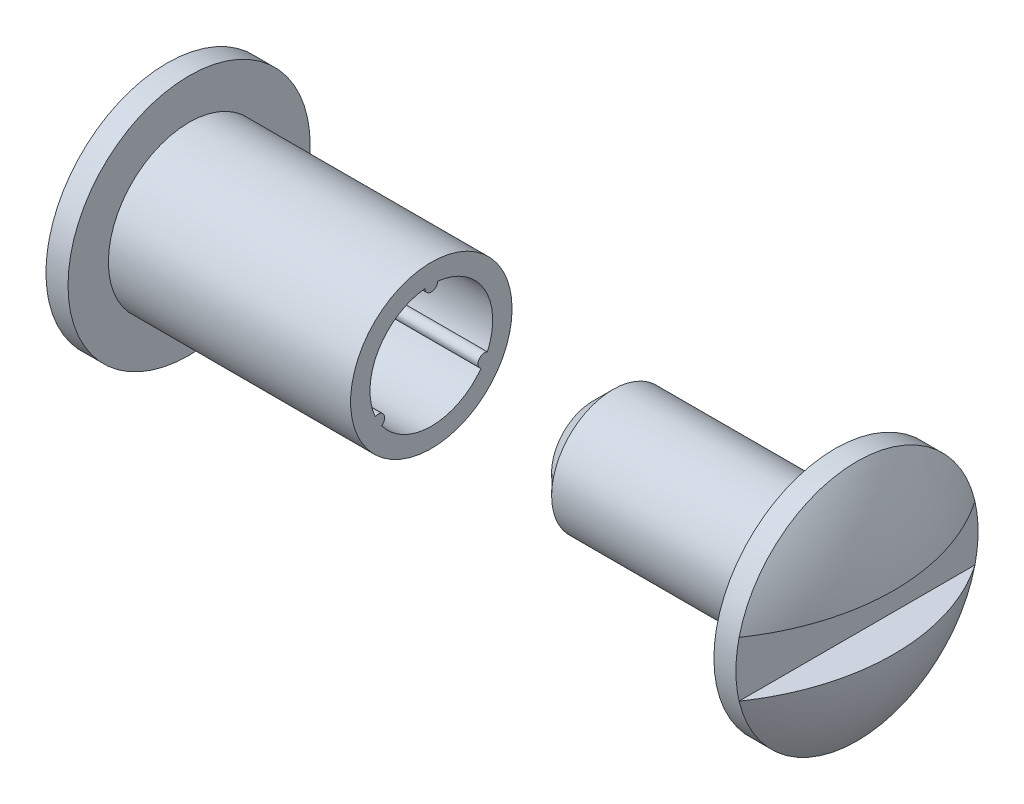
ISO-10303-21;
HEADER;
FILE_DESCRIPTION(('STEP AP214'),'2;1');
FILE_NAME('part.step','',(''),(''),'','','');
FILE_SCHEMA(('AUTOMOTIVE_DESIGN { 1 0 10303 214 1 1 1 1 }'));
ENDSEC;
DATA;
#1=APPLICATION_CONTEXT('core data for automotive mechanical design processes');
#2=APPLICATION_PROTOCOL_DEFINITION('international standard','automotive_design',2000,#1);
#3=PRODUCT_CONTEXT('',#1,'mechanical');
#4=PRODUCT('Part','Part','',(#3));
#5=PRODUCT_RELATED_PRODUCT_CATEGORY('part','',(#4));
#6=PRODUCT_DEFINITION_FORMATION('','',#4);
#7=PRODUCT_DEFINITION_CONTEXT('part definition',#1,'design');
#8=PRODUCT_DEFINITION('design','',#6,#7);
#9=PRODUCT_DEFINITION_SHAPE('','',#8);
#10=(LENGTH_UNIT() NAMED_UNIT(*) SI_UNIT(.MILLI.,.METRE.));
#11=(NAMED_UNIT(*) PLANE_ANGLE_UNIT() SI_UNIT($,.RADIAN.));
#12=(NAMED_UNIT(*) SI_UNIT($,.STERADIAN.) SOLID_ANGLE_UNIT());
#13=UNCERTAINTY_MEASURE_WITH_UNIT(LENGTH_MEASURE(1.E-05),#10,'distance_accuracy_value','');
#14=(GEOMETRIC_REPRESENTATION_CONTEXT(3) GLOBAL_UNCERTAINTY_ASSIGNED_CONTEXT((#13)) GLOBAL_UNIT_ASSIGNED_CONTEXT((#10,
#11,#12)) REPRESENTATION_CONTEXT('',''));
#15=CARTESIAN_POINT('',(0.,0.,0.));
#16=DIRECTION('',(0.,0.,1.));
#17=DIRECTION('',(1.,0.,0.));
#18=AXIS2_PLACEMENT_3D('',#15,#16,#17);
#19=CARTESIAN_POINT('',(9.525,0.,0.));
#20=DIRECTION('',(1.,0.,0.));
#21=DIRECTION('',(0.,0.,-1.));
#22=AXIS2_PLACEMENT_3D('',#19,#20,#21);
#23=PLANE('',#22);
#24=CARTESIAN_POINT('',(9.525,0.,0.));
#25=DIRECTION('',(-1.,0.,0.));
#26=DIRECTION('',(0.,0.,1.));
#27=AXIS2_PLACEMENT_3D('',#24,#25,#26);
#28=CIRCLE('',#27,4.7625);
#29=CARTESIAN_POINT('',(9.525,0.,4.7625));
#30=VERTEX_POINT('',#29);
#31=EDGE_CURVE('E96',#30,#30,#28,.T.);
#32=ORIENTED_EDGE('',*,*,#31,.T.);
#33=EDGE_LOOP('',(#32));
#34=FACE_BOUND('',#33,.T.);
#35=CARTESIAN_POINT('',(9.525,0.,0.));
#36=DIRECTION('',(1.,0.,0.));
#37=DIRECTION('',(0.,0.,-1.));
#38=AXIS2_PLACEMENT_3D('',#35,#36,#37);
#39=CIRCLE('',#38,2.413);
#40=CARTESIAN_POINT('',(9.525,0.,2.413));
#41=VERTEX_POINT('',#40);
#42=EDGE_CURVE('E12',#41,#41,#39,.F.);
#43=ORIENTED_EDGE('',*,*,#42,.F.);
#44=EDGE_LOOP('',(#43));
#45=FACE_BOUND('',#44,.T.);
#46=ADVANCED_FACE('F53',(#34,#45),#23,.F.);
#47=CARTESIAN_POINT('',(3.65979150646579,0.,0.));
#48=DIRECTION('',(-1.,0.,0.));
#49=DIRECTION('',(0.,1.,0.));
#50=AXIS2_PLACEMENT_3D('',#47,#48,#49);
#51=SPHERICAL_SURFACE('',#50,8.24518849353421);
#52=CARTESIAN_POINT('',(10.3904472727273,0.,0.));
#53=DIRECTION('',(-1.,0.,0.));
#54=DIRECTION('',(0.,0.,1.));
#55=AXIS2_PLACEMENT_3D('',#52,#53,#54);
#56=CIRCLE('',#55,4.7625);
#57=CARTESIAN_POINT('',(10.3904472727273,1.08585,4.63706114122943));
#58=VERTEX_POINT('',#57);
#59=CARTESIAN_POINT('',(10.3904472727273,1.08585,-4.63706114122943));
#60=VERTEX_POINT('',#59);
#61=EDGE_CURVE('E89',#58,#60,#56,.T.);
#62=ORIENTED_EDGE('',*,*,#61,.F.);
#63=CARTESIAN_POINT('',(3.65979150646579,1.08585,0.));
#64=DIRECTION('',(0.,1.,0.));
#65=DIRECTION('',(0.,0.,1.));
#66=AXIS2_PLACEMENT_3D('',#63,#64,#65);
#67=CIRCLE('',#66,8.17337525575628);
#68=EDGE_CURVE('E62',#58,#60,#67,.T.);
#69=ORIENTED_EDGE('',*,*,#68,.T.);
#70=EDGE_LOOP('',(#62,#69));
#71=FACE_BOUND('',#70,.T.);
#72=ADVANCED_FACE('F99',(#71),#51,.T.);
#73=CARTESIAN_POINT('',(10.3904472727273,-1.08585,-4.63706114122943));
#74=VERTEX_POINT('',#73);
#75=CARTESIAN_POINT('',(10.3904472727273,-1.08585,4.63706114122943));
#76=VERTEX_POINT('',#75);
#77=EDGE_CURVE('E90',#74,#76,#56,.T.);
#78=ORIENTED_EDGE('',*,*,#77,.F.);
#79=CARTESIAN_POINT('',(3.65979150646579,-1.08585,0.));
#80=DIRECTION('',(0.,-1.,0.));
#81=DIRECTION('',(0.,0.,-1.));
#82=AXIS2_PLACEMENT_3D('',#79,#80,#81);
#83=CIRCLE('',#82,8.17337525575628);
#84=EDGE_CURVE('E101',#74,#76,#83,.T.);
#85=ORIENTED_EDGE('',*,*,#84,.T.);
#86=EDGE_LOOP('',(#78,#85));
#87=FACE_BOUND('',#86,.T.);
#88=ADVANCED_FACE('F55',(#87),#51,.T.);
#89=CARTESIAN_POINT('',(9.525,0.,0.));
#90=DIRECTION('',(-1.,0.,0.));
#91=DIRECTION('',(0.,0.,1.));
#92=AXIS2_PLACEMENT_3D('',#89,#90,#91);
#93=CYLINDRICAL_SURFACE('',#92,4.7625);
#94=ORIENTED_EDGE('',*,*,#31,.F.);
#95=EDGE_LOOP('',(#94));
#96=FACE_BOUND('',#95,.T.);
#97=EDGE_CURVE('E76',#76,#58,#56,.T.);
#98=ORIENTED_EDGE('',*,*,#97,.T.);
#99=ORIENTED_EDGE('',*,*,#61,.T.);
#100=EDGE_CURVE('E69',#60,#74,#56,.T.);
#101=ORIENTED_EDGE('',*,*,#100,.T.);
#102=ORIENTED_EDGE('',*,*,#77,.T.);
#103=EDGE_LOOP('',(#98,#99,#101,#102));
#104=FACE_BOUND('',#103,.T.);
#105=ADVANCED_FACE('F102',(#96,#104),#93,.T.);
#106=CARTESIAN_POINT('',(10.3904472727273,1.08585,4.7625));
#107=DIRECTION('',(0.,1.,0.));
#108=DIRECTION('',(0.,0.,1.));
#109=AXIS2_PLACEMENT_3D('',#106,#107,#108);
#110=PLANE('',#109);
#111=DIRECTION('',(0.,0.,1.));
#112=VECTOR('',#111,1.);
#113=CARTESIAN_POINT('',(10.3904472727273,1.08585,4.7625));
#114=LINE('',#113,#112);
#115=EDGE_CURVE('E84',#60,#58,#114,.T.);
#116=ORIENTED_EDGE('',*,*,#115,.F.);
#117=ORIENTED_EDGE('',*,*,#68,.F.);
#118=EDGE_LOOP('',(#116,#117));
#119=FACE_BOUND('',#118,.T.);
#120=ADVANCED_FACE('F94',(#119),#110,.F.);
#121=CARTESIAN_POINT('',(10.3904472727273,-1.08585,4.7625));
#122=DIRECTION('',(0.,-1.,0.));
#123=DIRECTION('',(0.,0.,-1.));
#124=AXIS2_PLACEMENT_3D('',#121,#122,#123);
#125=PLANE('',#124);
#126=DIRECTION('',(0.,0.,-1.));
#127=VECTOR('',#126,1.);
#128=CARTESIAN_POINT('',(10.3904472727273,-1.08585,4.7625));
#129=LINE('',#128,#127);
#130=EDGE_CURVE('E86',#76,#74,#129,.T.);
#131=ORIENTED_EDGE('',*,*,#130,.F.);
#132=ORIENTED_EDGE('',*,*,#84,.F.);
#133=EDGE_LOOP('',(#131,#132));
#134=FACE_BOUND('',#133,.T.);
#135=ADVANCED_FACE('F124',(#134),#125,.F.);
#136=CARTESIAN_POINT('',(10.3904472727273,-1.08585,4.7625));
#137=DIRECTION('',(1.,0.,0.));
#138=DIRECTION('',(0.,0.,-1.));
#139=AXIS2_PLACEMENT_3D('',#136,#137,#138);
#140=PLANE('',#139);
#141=ORIENTED_EDGE('',*,*,#97,.F.);
#142=ORIENTED_EDGE('',*,*,#130,.T.);
#143=ORIENTED_EDGE('',*,*,#100,.F.);
#144=ORIENTED_EDGE('',*,*,#115,.T.);
#145=EDGE_LOOP('',(#141,#142,#143,#144));
#146=FACE_BOUND('',#145,.T.);
#147=ADVANCED_FACE('F83',(#146),#140,.T.);
#148=CARTESIAN_POINT('',(9.525,0.,0.));
#149=DIRECTION('',(-1.,0.,0.));
#150=DIRECTION('',(0.,0.,1.));
#151=AXIS2_PLACEMENT_3D('',#148,#149,#150);
#152=CYLINDRICAL_SURFACE('',#151,2.413);
#153=CARTESIAN_POINT('',(0.793750000000006,0.,0.));
#154=DIRECTION('',(1.,0.,0.));
#155=DIRECTION('',(0.,0.,-1.));
#156=AXIS2_PLACEMENT_3D('',#153,#154,#155);
#157=CIRCLE('',#156,2.413);
#158=CARTESIAN_POINT('',(0.793750000000006,0.,2.413));
#159=VERTEX_POINT('',#158);
#160=EDGE_CURVE('E153',#159,#159,#157,.T.);
#161=CARTESIAN_POINT('',(0.793750000000006,0.,2.413));
#162=CARTESIAN_POINT('',(0.884700520833339,0.,2.413));
#163=CARTESIAN_POINT('',(0.975651041666672,0.,2.413));
#164=CARTESIAN_POINT('',(1.15755208333334,0.,2.413));
#165=CARTESIAN_POINT('',(1.24850260416667,0.,2.413));
#166=CARTESIAN_POINT('',(1.43040364583334,0.,2.413));
#167=CARTESIAN_POINT('',(1.52135416666667,0.,2.413));
#168=CARTESIAN_POINT('',(1.70325520833334,0.,2.413));
#169=CARTESIAN_POINT('',(1.79420572916667,0.,2.413));
#170=CARTESIAN_POINT('',(1.97610677083334,0.,2.413));
#171=CARTESIAN_POINT('',(2.06705729166667,0.,2.413));
#172=CARTESIAN_POINT('',(2.24895833333334,0.,2.413));
#173=CARTESIAN_POINT('',(2.33990885416667,0.,2.413));
#174=CARTESIAN_POINT('',(2.52180989583334,0.,2.413));
#175=CARTESIAN_POINT('',(2.61276041666667,0.,2.413));
#176=CARTESIAN_POINT('',(2.79466145833334,0.,2.413));
#177=CARTESIAN_POINT('',(2.88561197916667,0.,2.413));
#178=CARTESIAN_POINT('',(3.06751302083334,0.,2.413));
#179=CARTESIAN_POINT('',(3.15846354166667,0.,2.413));
#180=CARTESIAN_POINT('',(3.34036458333334,0.,2.413));
#181=CARTESIAN_POINT('',(3.43131510416667,0.,2.413));
#182=CARTESIAN_POINT('',(3.61321614583334,0.,2.413));
#183=CARTESIAN_POINT('',(3.70416666666667,0.,2.413));
#184=CARTESIAN_POINT('',(3.88606770833334,0.,2.413));
#185=CARTESIAN_POINT('',(3.97701822916667,0.,2.413));
#186=CARTESIAN_POINT('',(4.15891927083334,0.,2.413));
#187=CARTESIAN_POINT('',(4.24986979166667,0.,2.413));
#188=CARTESIAN_POINT('',(4.43177083333334,0.,2.413));
#189=CARTESIAN_POINT('',(4.52272135416667,0.,2.413));
#190=CARTESIAN_POINT('',(4.70462239583334,0.,2.413));
#191=CARTESIAN_POINT('',(4.79557291666667,0.,2.413));
#192=CARTESIAN_POINT('',(4.97747395833334,0.,2.413));
#193=CARTESIAN_POINT('',(5.06842447916667,0.,2.413));
#194=CARTESIAN_POINT('',(5.25032552083334,0.,2.413));
#195=CARTESIAN_POINT('',(5.34127604166667,0.,2.413));
#196=CARTESIAN_POINT('',(5.52317708333334,0.,2.413));
#197=CARTESIAN_POINT('',(5.61412760416667,0.,2.413));
#198=CARTESIAN_POINT('',(5.79602864583334,0.,2.413));
#199=CARTESIAN_POINT('',(5.88697916666667,0.,2.413));
#200=CARTESIAN_POINT('',(6.06888020833333,0.,2.413));
#201=CARTESIAN_POINT('',(6.15983072916667,0.,2.413));
#202=CARTESIAN_POINT('',(6.34173177083334,0.,2.413));
#203=CARTESIAN_POINT('',(6.43268229166667,0.,2.413));
#204=CARTESIAN_POINT('',(6.61458333333333,0.,2.413));
#205=CARTESIAN_POINT('',(6.70553385416667,0.,2.413));
#206=CARTESIAN_POINT('',(6.88743489583334,0.,2.413));
#207=CARTESIAN_POINT('',(6.97838541666667,0.,2.413));
#208=CARTESIAN_POINT('',(7.16028645833333,0.,2.413));
#209=CARTESIAN_POINT('',(7.25123697916667,0.,2.413));
#210=CARTESIAN_POINT('',(7.43313802083333,0.,2.413));
#211=CARTESIAN_POINT('',(7.52408854166667,0.,2.413));
#212=CARTESIAN_POINT('',(7.70598958333333,0.,2.413));
#213=CARTESIAN_POINT('',(7.79694010416667,0.,2.413));
#214=CARTESIAN_POINT('',(7.97884114583333,0.,2.413));
#215=CARTESIAN_POINT('',(8.06979166666667,0.,2.413));
#216=CARTESIAN_POINT('',(8.25169270833333,0.,2.413));
#217=CARTESIAN_POINT('',(8.34264322916667,0.,2.413));
#218=CARTESIAN_POINT('',(8.52454427083333,0.,2.413));
#219=CARTESIAN_POINT('',(8.61549479166667,0.,2.413));
#220=CARTESIAN_POINT('',(8.79739583333333,0.,2.413));
#221=CARTESIAN_POINT('',(8.88834635416667,0.,2.413));
#222=CARTESIAN_POINT('',(9.07024739583333,0.,2.413));
#223=CARTESIAN_POINT('',(9.16119791666667,0.,2.413));
#224=CARTESIAN_POINT('',(9.34309895833333,0.,2.413));
#225=CARTESIAN_POINT('',(9.43404947916667,0.,2.413));
#226=CARTESIAN_POINT('',(9.525,0.,2.413));
#227=B_SPLINE_CURVE_WITH_KNOTS('',3,(#161,#162,#163,#164,#165,#166,#167,#168,#169,#170,#171,
#172,#173,#174,#175,#176,#177,#178,#179,#180,#181,#182,#183,#184,#185,#186,#187,#188,#189,#190,
#191,#192,#193,#194,#195,#196,#197,#198,#199,#200,#201,#202,#203,#204,#205,#206,#207,#208,#209,
#210,#211,#212,#213,#214,#215,#216,#217,#218,#219,#220,#221,#222,#223,#224,#225,#226),
.UNSPECIFIED.,.F.,.F.,(4,2,2,2,2,2,2,2,2,2,2,2,2,2,2,2,2,2,2,2,2,2,2,2,2,2,2,2,2,2,2,2,4),(0.,
0.272851562499999,0.545703125,0.818554687499999,1.09140625,1.3642578125,1.637109375,
1.9099609375,2.1828125,2.4556640625,2.728515625,3.0013671875,3.27421875,3.5470703125,
3.819921875,4.0927734375,4.365625,4.6384765625,4.911328125,5.1841796875,5.45703125,
5.72988281249999,6.002734375,6.27558593749999,6.54843749999999,6.82128906249999,
7.09414062499999,7.36699218749999,7.63984374999999,7.91269531249999,8.18554687499999,
8.45839843749999,8.73124999999999),.UNSPECIFIED.);
#228=EDGE_CURVE('BSEAM136',#159,#41,#227,.T.);
#229=ORIENTED_EDGE('',*,*,#160,.T.);
#230=ORIENTED_EDGE('',*,*,#42,.T.);
#231=ORIENTED_EDGE('',*,*,#228,.T.);
#232=ORIENTED_EDGE('',*,*,#228,.F.);
#233=EDGE_LOOP('',(#229,#231,#230,#232));
#234=FACE_BOUND('',#233,.T.);
#235=ADVANCED_FACE('F136',(#234),#152,.T.);
#236=CARTESIAN_POINT('',(0.,0.,0.));
#237=DIRECTION('',(1.,0.,0.));
#238=DIRECTION('',(0.,0.,-1.));
#239=AXIS2_PLACEMENT_3D('',#236,#237,#238);
#240=PLANE('',#239);
#241=CARTESIAN_POINT('',(0.,0.,0.));
#242=DIRECTION('',(1.,0.,0.));
#243=DIRECTION('',(0.,0.,-1.));
#244=AXIS2_PLACEMENT_3D('',#241,#242,#243);
#245=CIRCLE('',#244,1.61924999999999);
#246=CARTESIAN_POINT('',(0.,0.,-1.61924999999999));
#247=VERTEX_POINT('',#246);
#248=EDGE_CURVE('E151',#247,#247,#245,.F.);
#249=ORIENTED_EDGE('',*,*,#248,.T.);
#250=EDGE_LOOP('',(#249));
#251=FACE_BOUND('',#250,.T.);
#252=ADVANCED_FACE('F140',(#251),#240,.F.);
#253=CARTESIAN_POINT('',(0.793750000000006,0.,0.));
#254=DIRECTION('',(1.,0.,0.));
#255=DIRECTION('',(0.,0.,-1.));
#256=AXIS2_PLACEMENT_3D('',#253,#254,#255);
#257=CONICAL_SURFACE('',#256,2.413,0.785398163397451);
#258=ORIENTED_EDGE('',*,*,#248,.F.);
#259=EDGE_LOOP('',(#258));
#260=FACE_BOUND('',#259,.T.);
#261=ORIENTED_EDGE('',*,*,#160,.F.);
#262=EDGE_LOOP('',(#261));
#263=FACE_BOUND('',#262,.T.);
#264=ADVANCED_FACE('F137',(#260,#263),#257,.T.);
#265=CLOSED_SHELL('',(#46,#72,#88,#105,#120,#135,#147,#235,#252,#264));
#266=MANIFOLD_SOLID_BREP('B2',#265);
#267=CARTESIAN_POINT('',(-24.8552561210692,0.,0.));
#268=DIRECTION('',(1.,0.,0.));
#269=DIRECTION('',(0.,0.,-1.));
#270=AXIS2_PLACEMENT_3D('',#267,#268,#269);
#271=CYLINDRICAL_SURFACE('',#270,3.175);
#272=CARTESIAN_POINT('',(-6.35,0.,0.));
#273=DIRECTION('',(1.,0.,0.));
#274=DIRECTION('',(0.,0.,-1.));
#275=AXIS2_PLACEMENT_3D('',#272,#273,#274);
#276=CIRCLE('',#275,3.175);
#277=CARTESIAN_POINT('',(-6.35,0.,-3.175));
#278=VERTEX_POINT('',#277);
#279=EDGE_CURVE('E313',#278,#278,#276,.T.);
#280=ORIENTED_EDGE('',*,*,#279,.F.);
#281=EDGE_LOOP('',(#280));
#282=FACE_BOUND('',#281,.T.);
#283=CARTESIAN_POINT('',(-15.875,0.,0.));
#284=DIRECTION('',(-1.,0.,0.));
#285=DIRECTION('',(0.,0.,1.));
#286=AXIS2_PLACEMENT_3D('',#283,#284,#285);
#287=CIRCLE('',#286,3.175);
#288=CARTESIAN_POINT('',(-15.875,0.,3.175));
#289=VERTEX_POINT('',#288);
#290=EDGE_CURVE('E300',#289,#289,#287,.F.);
#291=ORIENTED_EDGE('',*,*,#290,.T.);
#292=EDGE_LOOP('',(#291));
#293=FACE_BOUND('',#292,.T.);
#294=ADVANCED_FACE('F225',(#282,#293),#271,.T.);
#295=CARTESIAN_POINT('',(-24.8552561210692,2.413,0.));
#296=DIRECTION('',(1.,0.,0.));
#297=DIRECTION('',(0.,0.,-1.));
#298=AXIS2_PLACEMENT_3D('',#295,#296,#297);
#299=CYLINDRICAL_SURFACE('',#298,0.254);
#300=CARTESIAN_POINT('',(-15.875,2.413,0.));
#301=DIRECTION('',(-1.,0.,0.));
#302=DIRECTION('',(0.,0.,1.));
#303=AXIS2_PLACEMENT_3D('',#300,#301,#302);
#304=CIRCLE('',#303,0.254);
#305=CARTESIAN_POINT('',(-15.875,2.39963157894737,-0.253647955478768));
#306=VERTEX_POINT('',#305);
#307=CARTESIAN_POINT('',(-15.875,2.39963157894737,0.253647955478769));
#308=VERTEX_POINT('',#307);
#309=EDGE_CURVE('E294',#306,#308,#304,.T.);
#310=ORIENTED_EDGE('',*,*,#309,.F.);
#311=DIRECTION('',(1.,0.,0.));
#312=VECTOR('',#311,1.);
#313=CARTESIAN_POINT('',(-24.8552561210692,2.39963157894737,-0.253647955478768));
#314=LINE('',#313,#312);
#315=CARTESIAN_POINT('',(-6.35,2.39963157894737,-0.253647955478768));
#316=VERTEX_POINT('',#315);
#317=EDGE_CURVE('E297',#306,#316,#314,.T.);
#318=ORIENTED_EDGE('',*,*,#317,.T.);
#319=CARTESIAN_POINT('',(-6.35,2.413,0.));
#320=DIRECTION('',(-1.,0.,0.));
#321=DIRECTION('',(0.,0.,-1.));
#322=AXIS2_PLACEMENT_3D('',#319,#320,#321);
#323=CIRCLE('',#322,0.254);
#324=CARTESIAN_POINT('',(-6.35,2.39963157894737,0.253647955478769));
#325=VERTEX_POINT('',#324);
#326=EDGE_CURVE('E299',#316,#325,#323,.T.);
#327=ORIENTED_EDGE('',*,*,#326,.T.);
#328=DIRECTION('',(1.,0.,0.));
#329=VECTOR('',#328,1.);
#330=CARTESIAN_POINT('',(-24.8552561210692,2.39963157894737,0.253647955478769));
#331=LINE('',#330,#329);
#332=EDGE_CURVE('E229',#308,#325,#331,.T.);
#333=ORIENTED_EDGE('',*,*,#332,.F.);
#334=EDGE_LOOP('',(#310,#318,#327,#333));
#335=FACE_BOUND('',#334,.T.);
#336=ADVANCED_FACE('F227',(#335),#299,.T.);
#337=CARTESIAN_POINT('',(-24.8552561210692,0.,0.));
#338=DIRECTION('',(1.,0.,0.));
#339=DIRECTION('',(0.,0.,-1.));
#340=AXIS2_PLACEMENT_3D('',#337,#338,#339);
#341=CYLINDRICAL_SURFACE('',#340,2.413);
#342=CARTESIAN_POINT('',(-15.875,0.,0.));
#343=DIRECTION('',(-1.,0.,0.));
#344=DIRECTION('',(0.,0.,1.));
#345=AXIS2_PLACEMENT_3D('',#342,#343,#344);
#346=CIRCLE('',#345,2.413);
#347=CARTESIAN_POINT('',(-15.875,-0.980150216411078,-2.20496588483117));
#348=VERTEX_POINT('',#347);
#349=EDGE_CURVE('E316',#348,#306,#346,.F.);
#350=ORIENTED_EDGE('',*,*,#349,.F.);
#351=DIRECTION('',(1.,0.,0.));
#352=VECTOR('',#351,1.);
#353=CARTESIAN_POINT('',(-24.8552561210692,-0.980150216411078,-2.20496588483117));
#354=LINE('',#353,#352);
#355=CARTESIAN_POINT('',(-6.35,-0.980150216411078,-2.20496588483117));
#356=VERTEX_POINT('',#355);
#357=EDGE_CURVE('E301',#348,#356,#354,.T.);
#358=ORIENTED_EDGE('',*,*,#357,.T.);
#359=CARTESIAN_POINT('',(-6.35,0.,0.));
#360=DIRECTION('',(1.,0.,0.));
#361=DIRECTION('',(0.,0.,-1.));
#362=AXIS2_PLACEMENT_3D('',#359,#360,#361);
#363=CIRCLE('',#362,2.413);
#364=EDGE_CURVE('E303',#356,#316,#363,.T.);
#365=ORIENTED_EDGE('',*,*,#364,.T.);
#366=ORIENTED_EDGE('',*,*,#317,.F.);
#367=EDGE_LOOP('',(#350,#358,#365,#366));
#368=FACE_BOUND('',#367,.T.);
#369=ADVANCED_FACE('F329',(#368),#341,.F.);
#370=CARTESIAN_POINT('',(-24.8552561210692,-1.20649999999999,-2.08971929933185));
#371=DIRECTION('',(1.,0.,0.));
#372=DIRECTION('',(0.,0.,-1.));
#373=AXIS2_PLACEMENT_3D('',#370,#371,#372);
#374=CYLINDRICAL_SURFACE('',#373,0.254);
#375=CARTESIAN_POINT('',(-15.875,-1.20649999999999,-2.08971929933185));
#376=DIRECTION('',(-1.,0.,0.));
#377=DIRECTION('',(0.,0.,1.));
#378=AXIS2_PLACEMENT_3D('',#375,#376,#377);
#379=CIRCLE('',#378,0.254);
#380=CARTESIAN_POINT('',(-15.875,-1.41948136253628,-1.9513179293524));
#381=VERTEX_POINT('',#380);
#382=EDGE_CURVE('E51',#381,#348,#379,.T.);
#383=ORIENTED_EDGE('',*,*,#382,.F.);
#384=DIRECTION('',(1.,0.,0.));
#385=VECTOR('',#384,1.);
#386=CARTESIAN_POINT('',(-24.8552561210692,-1.41948136253628,-1.9513179293524));
#387=LINE('',#386,#385);
#388=CARTESIAN_POINT('',(-6.35,-1.41948136253628,-1.9513179293524));
#389=VERTEX_POINT('',#388);
#390=EDGE_CURVE('E272',#381,#389,#387,.T.);
#391=ORIENTED_EDGE('',*,*,#390,.T.);
#392=CARTESIAN_POINT('',(-6.35,-1.20649999999999,-2.08971929933185));
#393=DIRECTION('',(-1.,0.,0.));
#394=DIRECTION('',(0.,0.,-1.));
#395=AXIS2_PLACEMENT_3D('',#392,#393,#394);
#396=CIRCLE('',#395,0.254);
#397=EDGE_CURVE('E286',#389,#356,#396,.T.);
#398=ORIENTED_EDGE('',*,*,#397,.T.);
#399=ORIENTED_EDGE('',*,*,#357,.F.);
#400=EDGE_LOOP('',(#383,#391,#398,#399));
#401=FACE_BOUND('',#400,.T.);
#402=ADVANCED_FACE('F344',(#401),#374,.T.);
#403=CARTESIAN_POINT('',(-24.8552561210692,0.,0.));
#404=DIRECTION('',(1.,0.,0.));
#405=DIRECTION('',(0.,0.,-1.));
#406=AXIS2_PLACEMENT_3D('',#403,#404,#405);
#407=CYLINDRICAL_SURFACE('',#406,2.413);
#408=CARTESIAN_POINT('',(-15.875,0.,0.));
#409=DIRECTION('',(-1.,0.,0.));
#410=DIRECTION('',(0.,0.,1.));
#411=AXIS2_PLACEMENT_3D('',#408,#409,#410);
#412=CIRCLE('',#411,2.413);
#413=CARTESIAN_POINT('',(-15.875,-1.41948136253628,1.9513179293524));
#414=VERTEX_POINT('',#413);
#415=EDGE_CURVE('E235',#414,#381,#412,.F.);
#416=ORIENTED_EDGE('',*,*,#415,.F.);
#417=DIRECTION('',(1.,0.,0.));
#418=VECTOR('',#417,1.);
#419=CARTESIAN_POINT('',(-24.8552561210692,-1.41948136253628,1.9513179293524));
#420=LINE('',#419,#418);
#421=CARTESIAN_POINT('',(-6.35,-1.41948136253628,1.9513179293524));
#422=VERTEX_POINT('',#421);
#423=EDGE_CURVE('E267',#414,#422,#420,.T.);
#424=ORIENTED_EDGE('',*,*,#423,.T.);
#425=CARTESIAN_POINT('',(-6.35,0.,0.));
#426=DIRECTION('',(1.,0.,0.));
#427=DIRECTION('',(0.,0.,-1.));
#428=AXIS2_PLACEMENT_3D('',#425,#426,#427);
#429=CIRCLE('',#428,2.413);
#430=EDGE_CURVE('E285',#422,#389,#429,.T.);
#431=ORIENTED_EDGE('',*,*,#430,.T.);
#432=ORIENTED_EDGE('',*,*,#390,.F.);
#433=EDGE_LOOP('',(#416,#424,#431,#432));
#434=FACE_BOUND('',#433,.T.);
#435=ADVANCED_FACE('F271',(#434),#407,.F.);
#436=CARTESIAN_POINT('',(-24.8552561210692,-1.20649999999999,2.08971929933185));
#437=DIRECTION('',(1.,0.,0.));
#438=DIRECTION('',(0.,0.,-1.));
#439=AXIS2_PLACEMENT_3D('',#436,#437,#438);
#440=CYLINDRICAL_SURFACE('',#439,0.254);
#441=CARTESIAN_POINT('',(-15.875,-1.20649999999999,2.08971929933185));
#442=DIRECTION('',(-1.,0.,0.));
#443=DIRECTION('',(0.,0.,1.));
#444=AXIS2_PLACEMENT_3D('',#441,#442,#443);
#445=CIRCLE('',#444,0.254);
#446=CARTESIAN_POINT('',(-15.875,-0.980150216411079,2.20496588483117));
#447=VERTEX_POINT('',#446);
#448=EDGE_CURVE('E275',#447,#414,#445,.T.);
#449=ORIENTED_EDGE('',*,*,#448,.F.);
#450=DIRECTION('',(1.,0.,0.));
#451=VECTOR('',#450,1.);
#452=CARTESIAN_POINT('',(-24.8552561210692,-0.980150216411079,2.20496588483117));
#453=LINE('',#452,#451);
#454=CARTESIAN_POINT('',(-6.35,-0.980150216411079,2.20496588483117));
#455=VERTEX_POINT('',#454);
#456=EDGE_CURVE('E304',#447,#455,#453,.T.);
#457=ORIENTED_EDGE('',*,*,#456,.T.);
#458=CARTESIAN_POINT('',(-6.35,-1.20649999999999,2.08971929933185));
#459=DIRECTION('',(-1.,0.,0.));
#460=DIRECTION('',(0.,0.,-1.));
#461=AXIS2_PLACEMENT_3D('',#458,#459,#460);
#462=CIRCLE('',#461,0.254);
#463=EDGE_CURVE('E283',#455,#422,#462,.T.);
#464=ORIENTED_EDGE('',*,*,#463,.T.);
#465=ORIENTED_EDGE('',*,*,#423,.F.);
#466=EDGE_LOOP('',(#449,#457,#464,#465));
#467=FACE_BOUND('',#466,.T.);
#468=ADVANCED_FACE('F279',(#467),#440,.T.);
#469=CARTESIAN_POINT('',(-24.8552561210692,0.,0.));
#470=DIRECTION('',(1.,0.,0.));
#471=DIRECTION('',(0.,0.,-1.));
#472=AXIS2_PLACEMENT_3D('',#469,#470,#471);
#473=CYLINDRICAL_SURFACE('',#472,2.413);
#474=CARTESIAN_POINT('',(-15.875,0.,0.));
#475=DIRECTION('',(-1.,0.,0.));
#476=DIRECTION('',(0.,0.,1.));
#477=AXIS2_PLACEMENT_3D('',#474,#475,#476);
#478=CIRCLE('',#477,2.413);
#479=EDGE_CURVE('E292',#308,#447,#478,.F.);
#480=ORIENTED_EDGE('',*,*,#479,.F.);
#481=ORIENTED_EDGE('',*,*,#332,.T.);
#482=CARTESIAN_POINT('',(-6.35,0.,0.));
#483=DIRECTION('',(1.,0.,0.));
#484=DIRECTION('',(0.,0.,-1.));
#485=AXIS2_PLACEMENT_3D('',#482,#483,#484);
#486=CIRCLE('',#485,2.413);
#487=EDGE_CURVE('E311',#325,#455,#486,.T.);
#488=ORIENTED_EDGE('',*,*,#487,.T.);
#489=ORIENTED_EDGE('',*,*,#456,.F.);
#490=EDGE_LOOP('',(#480,#481,#488,#489));
#491=FACE_BOUND('',#490,.T.);
#492=ADVANCED_FACE('F362',(#491),#473,.F.);
#493=CARTESIAN_POINT('',(-6.35,0.,0.));
#494=DIRECTION('',(1.,0.,0.));
#495=DIRECTION('',(0.,0.,-1.));
#496=AXIS2_PLACEMENT_3D('',#493,#494,#495);
#497=PLANE('',#496);
#498=ORIENTED_EDGE('',*,*,#326,.F.);
#499=ORIENTED_EDGE('',*,*,#364,.F.);
#500=ORIENTED_EDGE('',*,*,#397,.F.);
#501=ORIENTED_EDGE('',*,*,#430,.F.);
#502=ORIENTED_EDGE('',*,*,#463,.F.);
#503=ORIENTED_EDGE('',*,*,#487,.F.);
#504=EDGE_LOOP('',(#498,#499,#500,#501,#502,#503));
#505=FACE_BOUND('',#504,.T.);
#506=ORIENTED_EDGE('',*,*,#279,.T.);
#507=EDGE_LOOP('',(#506));
#508=FACE_BOUND('',#507,.T.);
#509=ADVANCED_FACE('F334',(#505,#508),#497,.T.);
#510=CARTESIAN_POINT('',(-15.875,0.,0.));
#511=DIRECTION('',(-1.,0.,0.));
#512=DIRECTION('',(0.,0.,-1.));
#513=AXIS2_PLACEMENT_3D('',#510,#511,#512);
#514=PLANE('',#513);
#515=ORIENTED_EDGE('',*,*,#349,.T.);
#516=ORIENTED_EDGE('',*,*,#309,.T.);
#517=ORIENTED_EDGE('',*,*,#479,.T.);
#518=ORIENTED_EDGE('',*,*,#448,.T.);
#519=ORIENTED_EDGE('',*,*,#415,.T.);
#520=ORIENTED_EDGE('',*,*,#382,.T.);
#521=EDGE_LOOP('',(#515,#516,#517,#518,#519,#520));
#522=FACE_BOUND('',#521,.T.);
#523=ADVANCED_FACE('F290',(#522),#514,.F.);
#524=CARTESIAN_POINT('',(-10.0097915064658,0.,0.));
#525=DIRECTION('',(1.,0.,0.));
#526=DIRECTION('',(0.,1.,0.));
#527=AXIS2_PLACEMENT_3D('',#524,#525,#526);
#528=SPHERICAL_SURFACE('',#527,8.24518849353421);
#529=CARTESIAN_POINT('',(-16.7404472727273,0.,0.));
#530=DIRECTION('',(-1.,0.,0.));
#531=DIRECTION('',(0.,0.,1.));
#532=AXIS2_PLACEMENT_3D('',#529,#530,#531);
#533=CIRCLE('',#532,4.7625);
#534=CARTESIAN_POINT('',(-16.7404472727273,1.08585,4.63706114122943));
#535=VERTEX_POINT('',#534);
#536=CARTESIAN_POINT('',(-16.7404472727273,1.08585,-4.63706114122943));
#537=VERTEX_POINT('',#536);
#538=EDGE_CURVE('E528',#535,#537,#533,.T.);
#539=ORIENTED_EDGE('',*,*,#538,.T.);
#540=CARTESIAN_POINT('',(-10.0097915064658,1.08585,0.));
#541=DIRECTION('',(0.,-1.,0.));
#542=DIRECTION('',(0.,0.,1.));
#543=AXIS2_PLACEMENT_3D('',#540,#541,#542);
#544=CIRCLE('',#543,8.17337525575628);
#545=EDGE_CURVE('E533',#535,#537,#544,.T.);
#546=ORIENTED_EDGE('',*,*,#545,.F.);
#547=EDGE_LOOP('',(#539,#546));
#548=FACE_BOUND('',#547,.T.);
#549=ADVANCED_FACE('F386',(#548),#528,.T.);
#550=CARTESIAN_POINT('',(-16.7404472727273,-1.08585,-4.63706114122943));
#551=VERTEX_POINT('',#550);
#552=CARTESIAN_POINT('',(-16.7404472727273,-1.08585,4.63706114122943));
#553=VERTEX_POINT('',#552);
#554=EDGE_CURVE('E530',#551,#553,#533,.T.);
#555=ORIENTED_EDGE('',*,*,#554,.T.);
#556=CARTESIAN_POINT('',(-10.0097915064658,-1.08585,0.));
#557=DIRECTION('',(0.,1.,0.));
#558=DIRECTION('',(0.,0.,-1.));
#559=AXIS2_PLACEMENT_3D('',#556,#557,#558);
#560=CIRCLE('',#559,8.17337525575628);
#561=EDGE_CURVE('E527',#551,#553,#560,.T.);
#562=ORIENTED_EDGE('',*,*,#561,.F.);
#563=EDGE_LOOP('',(#555,#562));
#564=FACE_BOUND('',#563,.T.);
#565=ADVANCED_FACE('F393',(#564),#528,.T.);
#566=CARTESIAN_POINT('',(-15.875,0.,0.));
#567=DIRECTION('',(1.,0.,0.));
#568=DIRECTION('',(0.,0.,1.));
#569=AXIS2_PLACEMENT_3D('',#566,#567,#568);
#570=CYLINDRICAL_SURFACE('',#569,4.7625);
#571=CARTESIAN_POINT('',(-15.875,0.,0.));
#572=DIRECTION('',(-1.,0.,0.));
#573=DIRECTION('',(0.,0.,1.));
#574=AXIS2_PLACEMENT_3D('',#571,#572,#573);
#575=CIRCLE('',#574,4.7625);
#576=CARTESIAN_POINT('',(-15.875,0.,4.7625));
#577=VERTEX_POINT('',#576);
#578=EDGE_CURVE('E537',#577,#577,#575,.T.);
#579=ORIENTED_EDGE('',*,*,#578,.T.);
#580=EDGE_LOOP('',(#579));
#581=FACE_BOUND('',#580,.T.);
#582=EDGE_CURVE('E512',#553,#535,#533,.T.);
#583=ORIENTED_EDGE('',*,*,#582,.F.);
#584=ORIENTED_EDGE('',*,*,#554,.F.);
#585=EDGE_CURVE('E534',#537,#551,#533,.T.);
#586=ORIENTED_EDGE('',*,*,#585,.F.);
#587=ORIENTED_EDGE('',*,*,#538,.F.);
#588=EDGE_LOOP('',(#583,#584,#586,#587));
#589=FACE_BOUND('',#588,.T.);
#590=ADVANCED_FACE('F400',(#581,#589),#570,.T.);
#591=ORIENTED_EDGE('',*,*,#290,.F.);
#592=EDGE_LOOP('',(#591));
#593=FACE_BOUND('',#592,.T.);
#594=ORIENTED_EDGE('',*,*,#578,.F.);
#595=EDGE_LOOP('',(#594));
#596=FACE_BOUND('',#595,.T.);
#597=ADVANCED_FACE('F388',(#593,#596),#514,.F.);
#598=CARTESIAN_POINT('',(-16.7404472727273,1.08585,4.7625));
#599=DIRECTION('',(0.,1.,0.));
#600=DIRECTION('',(0.,0.,1.));
#601=AXIS2_PLACEMENT_3D('',#598,#599,#600);
#602=PLANE('',#601);
#603=DIRECTION('',(0.,0.,1.));
#604=VECTOR('',#603,1.);
#605=CARTESIAN_POINT('',(-16.7404472727273,1.08585,4.7625));
#606=LINE('',#605,#604);
#607=EDGE_CURVE('E517',#537,#535,#606,.T.);
#608=ORIENTED_EDGE('',*,*,#607,.T.);
#609=ORIENTED_EDGE('',*,*,#545,.T.);
#610=EDGE_LOOP('',(#608,#609));
#611=FACE_BOUND('',#610,.T.);
#612=ADVANCED_FACE('F413',(#611),#602,.F.);
#613=CARTESIAN_POINT('',(-16.7404472727273,-1.08585,4.7625));
#614=DIRECTION('',(0.,-1.,0.));
#615=DIRECTION('',(0.,0.,-1.));
#616=AXIS2_PLACEMENT_3D('',#613,#614,#615);
#617=PLANE('',#616);
#618=DIRECTION('',(0.,0.,-1.));
#619=VECTOR('',#618,1.);
#620=CARTESIAN_POINT('',(-16.7404472727273,-1.08585,4.7625));
#621=LINE('',#620,#619);
#622=EDGE_CURVE('E521',#553,#551,#621,.T.);
#623=ORIENTED_EDGE('',*,*,#622,.T.);
#624=ORIENTED_EDGE('',*,*,#561,.T.);
#625=EDGE_LOOP('',(#623,#624));
#626=FACE_BOUND('',#625,.T.);
#627=ADVANCED_FACE('F421',(#626),#617,.F.);
#628=CARTESIAN_POINT('',(-16.7404472727273,-1.08585,4.7625));
#629=DIRECTION('',(-1.,0.,0.));
#630=DIRECTION('',(0.,0.,-1.));
#631=AXIS2_PLACEMENT_3D('',#628,#629,#630);
#632=PLANE('',#631);
#633=ORIENTED_EDGE('',*,*,#582,.T.);
#634=ORIENTED_EDGE('',*,*,#607,.F.);
#635=ORIENTED_EDGE('',*,*,#585,.T.);
#636=ORIENTED_EDGE('',*,*,#622,.F.);
#637=EDGE_LOOP('',(#633,#634,#635,#636));
#638=FACE_BOUND('',#637,.T.);
#639=ADVANCED_FACE('F428',(#638),#632,.T.);
#640=CLOSED_SHELL('',(#294,#336,#369,#402,#435,#468,#492,#509,#523,#549,#565,#590,#597,#612,
#627,#639));
#641=MANIFOLD_SOLID_BREP('B6',#640);
#642=ADVANCED_BREP_SHAPE_REPRESENTATION('',(#18,#266,#641),#14);
#643=SHAPE_DEFINITION_REPRESENTATION(#9,#642);
ENDSEC;
END-ISO-10303-21;
